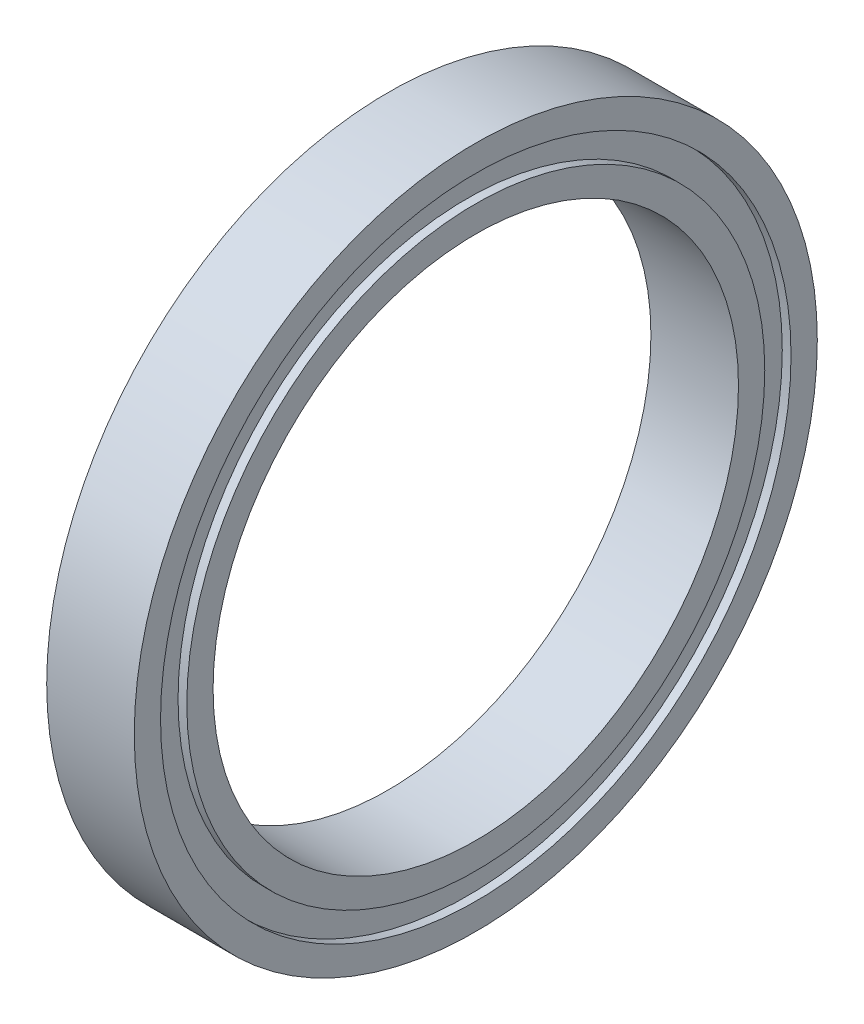
ISO-10303-21;
HEADER;
FILE_DESCRIPTION(('STEP AP214'),'2;1');
FILE_NAME('part.step','',(''),(''),'','','');
FILE_SCHEMA(('AUTOMOTIVE_DESIGN { 1 0 10303 214 1 1 1 1 }'));
ENDSEC;
DATA;
#1=APPLICATION_CONTEXT('core data for automotive mechanical design processes');
#2=APPLICATION_PROTOCOL_DEFINITION('international standard','automotive_design',2000,#1);
#3=PRODUCT_CONTEXT('',#1,'mechanical');
#4=PRODUCT('Part','Part','',(#3));
#5=PRODUCT_RELATED_PRODUCT_CATEGORY('part','',(#4));
#6=PRODUCT_DEFINITION_FORMATION('','',#4);
#7=PRODUCT_DEFINITION_CONTEXT('part definition',#1,'design');
#8=PRODUCT_DEFINITION('design','',#6,#7);
#9=PRODUCT_DEFINITION_SHAPE('','',#8);
#10=(LENGTH_UNIT() NAMED_UNIT(*) SI_UNIT(.MILLI.,.METRE.));
#11=(NAMED_UNIT(*) PLANE_ANGLE_UNIT() SI_UNIT($,.RADIAN.));
#12=(NAMED_UNIT(*) SI_UNIT($,.STERADIAN.) SOLID_ANGLE_UNIT());
#13=UNCERTAINTY_MEASURE_WITH_UNIT(LENGTH_MEASURE(1.E-05),#10,'distance_accuracy_value','');
#14=(GEOMETRIC_REPRESENTATION_CONTEXT(3) GLOBAL_UNCERTAINTY_ASSIGNED_CONTEXT((#13)) GLOBAL_UNIT_ASSIGNED_CONTEXT((#10,
#11,#12)) REPRESENTATION_CONTEXT('',''));
#15=CARTESIAN_POINT('',(0.,0.,0.));
#16=DIRECTION('',(0.,0.,1.));
#17=DIRECTION('',(1.,0.,0.));
#18=AXIS2_PLACEMENT_3D('',#15,#16,#17);
#19=CARTESIAN_POINT('',(0.,0.,0.));
#20=DIRECTION('',(1.,0.,0.));
#21=DIRECTION('',(0.,0.,-1.));
#22=AXIS2_PLACEMENT_3D('',#19,#20,#21);
#23=PLANE('',#22);
#24=CARTESIAN_POINT('',(0.,0.,0.));
#25=DIRECTION('',(1.,0.,0.));
#26=DIRECTION('',(0.,0.,-1.));
#27=AXIS2_PLACEMENT_3D('',#24,#25,#26);
#28=CIRCLE('',#27,30.);
#29=CARTESIAN_POINT('',(0.,0.,-30.));
#30=VERTEX_POINT('',#29);
#31=EDGE_CURVE('E52',#30,#30,#28,.T.);
#32=ORIENTED_EDGE('',*,*,#31,.T.);
#33=EDGE_LOOP('',(#32));
#34=FACE_BOUND('',#33,.T.);
#35=CARTESIAN_POINT('',(0.,0.,0.));
#36=DIRECTION('',(-1.,0.,0.));
#37=DIRECTION('',(0.,0.,1.));
#38=AXIS2_PLACEMENT_3D('',#35,#36,#37);
#39=CIRCLE('',#38,33.);
#40=CARTESIAN_POINT('',(0.,0.,33.));
#41=VERTEX_POINT('',#40);
#42=EDGE_CURVE('E76',#41,#41,#39,.T.);
#43=ORIENTED_EDGE('',*,*,#42,.T.);
#44=EDGE_LOOP('',(#43));
#45=FACE_BOUND('',#44,.T.);
#46=ADVANCED_FACE('F39',(#34,#45),#23,.F.);
#47=CARTESIAN_POINT('',(10.,0.,0.));
#48=DIRECTION('',(1.,0.,0.));
#49=DIRECTION('',(0.,0.,-1.));
#50=AXIS2_PLACEMENT_3D('',#47,#48,#49);
#51=PLANE('',#50);
#52=CARTESIAN_POINT('',(10.,0.,0.));
#53=DIRECTION('',(1.,0.,0.));
#54=DIRECTION('',(0.,0.,-1.));
#55=AXIS2_PLACEMENT_3D('',#52,#53,#54);
#56=CIRCLE('',#55,30.);
#57=CARTESIAN_POINT('',(10.,0.,-30.));
#58=VERTEX_POINT('',#57);
#59=EDGE_CURVE('E50',#58,#58,#56,.T.);
#60=ORIENTED_EDGE('',*,*,#59,.F.);
#61=EDGE_LOOP('',(#60));
#62=FACE_BOUND('',#61,.T.);
#63=CARTESIAN_POINT('',(10.,0.,0.));
#64=DIRECTION('',(1.,0.,0.));
#65=DIRECTION('',(0.,0.,-1.));
#66=AXIS2_PLACEMENT_3D('',#63,#64,#65);
#67=CIRCLE('',#66,33.);
#68=CARTESIAN_POINT('',(10.,0.,-33.));
#69=VERTEX_POINT('',#68);
#70=EDGE_CURVE('E64',#69,#69,#67,.T.);
#71=ORIENTED_EDGE('',*,*,#70,.T.);
#72=EDGE_LOOP('',(#71));
#73=FACE_BOUND('',#72,.T.);
#74=ADVANCED_FACE('F114',(#62,#73),#51,.T.);
#75=CARTESIAN_POINT('',(10.,0.,0.));
#76=DIRECTION('',(1.,0.,0.));
#77=DIRECTION('',(0.,0.,-1.));
#78=AXIS2_PLACEMENT_3D('',#75,#76,#77);
#79=CIRCLE('',#78,36.);
#80=CARTESIAN_POINT('',(10.,0.,-36.));
#81=VERTEX_POINT('',#80);
#82=EDGE_CURVE('E58',#81,#81,#79,.T.);
#83=ORIENTED_EDGE('',*,*,#82,.F.);
#84=EDGE_LOOP('',(#83));
#85=FACE_BOUND('',#84,.T.);
#86=CARTESIAN_POINT('',(10.,0.,0.));
#87=DIRECTION('',(1.,0.,0.));
#88=DIRECTION('',(0.,0.,-1.));
#89=AXIS2_PLACEMENT_3D('',#86,#87,#88);
#90=CIRCLE('',#89,39.);
#91=CARTESIAN_POINT('',(10.,0.,-39.));
#92=VERTEX_POINT('',#91);
#93=EDGE_CURVE('E10',#92,#92,#90,.T.);
#94=ORIENTED_EDGE('',*,*,#93,.T.);
#95=EDGE_LOOP('',(#94));
#96=FACE_BOUND('',#95,.T.);
#97=ADVANCED_FACE('F101',(#85,#96),#51,.T.);
#98=CARTESIAN_POINT('',(0.,0.,0.));
#99=DIRECTION('',(-1.,0.,0.));
#100=DIRECTION('',(0.,0.,1.));
#101=AXIS2_PLACEMENT_3D('',#98,#99,#100);
#102=CIRCLE('',#101,36.);
#103=CARTESIAN_POINT('',(0.,0.,36.));
#104=VERTEX_POINT('',#103);
#105=EDGE_CURVE('E70',#104,#104,#102,.T.);
#106=ORIENTED_EDGE('',*,*,#105,.F.);
#107=EDGE_LOOP('',(#106));
#108=FACE_BOUND('',#107,.T.);
#109=CARTESIAN_POINT('',(0.,0.,0.));
#110=DIRECTION('',(1.,0.,0.));
#111=DIRECTION('',(0.,0.,-1.));
#112=AXIS2_PLACEMENT_3D('',#109,#110,#111);
#113=CIRCLE('',#112,39.);
#114=CARTESIAN_POINT('',(0.,0.,-39.));
#115=VERTEX_POINT('',#114);
#116=EDGE_CURVE('E43',#115,#115,#113,.T.);
#117=ORIENTED_EDGE('',*,*,#116,.F.);
#118=EDGE_LOOP('',(#117));
#119=FACE_BOUND('',#118,.T.);
#120=ADVANCED_FACE('F98',(#108,#119),#23,.F.);
#121=CARTESIAN_POINT('',(10.,0.,0.));
#122=DIRECTION('',(-1.,0.,0.));
#123=DIRECTION('',(0.,0.,1.));
#124=AXIS2_PLACEMENT_3D('',#121,#122,#123);
#125=CYLINDRICAL_SURFACE('',#124,39.);
#126=ORIENTED_EDGE('',*,*,#93,.F.);
#127=EDGE_LOOP('',(#126));
#128=FACE_BOUND('',#127,.T.);
#129=ORIENTED_EDGE('',*,*,#116,.T.);
#130=EDGE_LOOP('',(#129));
#131=FACE_BOUND('',#130,.T.);
#132=ADVANCED_FACE('F41',(#128,#131),#125,.T.);
#133=CARTESIAN_POINT('',(10.,0.,0.));
#134=DIRECTION('',(-1.,0.,0.));
#135=DIRECTION('',(0.,0.,1.));
#136=AXIS2_PLACEMENT_3D('',#133,#134,#135);
#137=CYLINDRICAL_SURFACE('',#136,30.);
#138=ORIENTED_EDGE('',*,*,#59,.T.);
#139=EDGE_LOOP('',(#138));
#140=FACE_BOUND('',#139,.T.);
#141=ORIENTED_EDGE('',*,*,#31,.F.);
#142=EDGE_LOOP('',(#141));
#143=FACE_BOUND('',#142,.T.);
#144=ADVANCED_FACE('F105',(#140,#143),#137,.F.);
#145=CARTESIAN_POINT('',(9.,0.,0.));
#146=DIRECTION('',(1.,0.,0.));
#147=DIRECTION('',(0.,0.,-1.));
#148=AXIS2_PLACEMENT_3D('',#145,#146,#147);
#149=CYLINDRICAL_SURFACE('',#148,36.);
#150=CARTESIAN_POINT('',(9.,0.,0.));
#151=DIRECTION('',(1.,0.,0.));
#152=DIRECTION('',(0.,0.,-1.));
#153=AXIS2_PLACEMENT_3D('',#150,#151,#152);
#154=CIRCLE('',#153,36.);
#155=CARTESIAN_POINT('',(9.,0.,-36.));
#156=VERTEX_POINT('',#155);
#157=EDGE_CURVE('E55',#156,#156,#154,.T.);
#158=ORIENTED_EDGE('',*,*,#157,.F.);
#159=EDGE_LOOP('',(#158));
#160=FACE_BOUND('',#159,.T.);
#161=ORIENTED_EDGE('',*,*,#82,.T.);
#162=EDGE_LOOP('',(#161));
#163=FACE_BOUND('',#162,.T.);
#164=ADVANCED_FACE('F110',(#160,#163),#149,.F.);
#165=CARTESIAN_POINT('',(9.,0.,0.));
#166=DIRECTION('',(1.,0.,0.));
#167=DIRECTION('',(0.,0.,-1.));
#168=AXIS2_PLACEMENT_3D('',#165,#166,#167);
#169=PLANE('',#168);
#170=CARTESIAN_POINT('',(9.,0.,0.));
#171=DIRECTION('',(1.,0.,0.));
#172=DIRECTION('',(0.,0.,-1.));
#173=AXIS2_PLACEMENT_3D('',#170,#171,#172);
#174=CIRCLE('',#173,33.);
#175=CARTESIAN_POINT('',(9.,0.,-33.));
#176=VERTEX_POINT('',#175);
#177=EDGE_CURVE('E61',#176,#176,#174,.T.);
#178=ORIENTED_EDGE('',*,*,#177,.F.);
#179=EDGE_LOOP('',(#178));
#180=FACE_BOUND('',#179,.T.);
#181=ORIENTED_EDGE('',*,*,#157,.T.);
#182=EDGE_LOOP('',(#181));
#183=FACE_BOUND('',#182,.T.);
#184=ADVANCED_FACE('F128',(#180,#183),#169,.T.);
#185=CARTESIAN_POINT('',(9.,0.,0.));
#186=DIRECTION('',(1.,0.,0.));
#187=DIRECTION('',(0.,0.,-1.));
#188=AXIS2_PLACEMENT_3D('',#185,#186,#187);
#189=CYLINDRICAL_SURFACE('',#188,33.);
#190=ORIENTED_EDGE('',*,*,#177,.T.);
#191=EDGE_LOOP('',(#190));
#192=FACE_BOUND('',#191,.T.);
#193=ORIENTED_EDGE('',*,*,#70,.F.);
#194=EDGE_LOOP('',(#193));
#195=FACE_BOUND('',#194,.T.);
#196=ADVANCED_FACE('F94',(#192,#195),#189,.T.);
#197=CARTESIAN_POINT('',(1.,0.,0.));
#198=DIRECTION('',(-1.,0.,0.));
#199=DIRECTION('',(0.,0.,1.));
#200=AXIS2_PLACEMENT_3D('',#197,#198,#199);
#201=CYLINDRICAL_SURFACE('',#200,36.);
#202=CARTESIAN_POINT('',(1.,0.,0.));
#203=DIRECTION('',(-1.,0.,0.));
#204=DIRECTION('',(0.,0.,1.));
#205=AXIS2_PLACEMENT_3D('',#202,#203,#204);
#206=CIRCLE('',#205,36.);
#207=CARTESIAN_POINT('',(1.,0.,36.));
#208=VERTEX_POINT('',#207);
#209=EDGE_CURVE('E67',#208,#208,#206,.T.);
#210=ORIENTED_EDGE('',*,*,#209,.F.);
#211=EDGE_LOOP('',(#210));
#212=FACE_BOUND('',#211,.T.);
#213=ORIENTED_EDGE('',*,*,#105,.T.);
#214=EDGE_LOOP('',(#213));
#215=FACE_BOUND('',#214,.T.);
#216=ADVANCED_FACE('F88',(#212,#215),#201,.F.);
#217=CARTESIAN_POINT('',(1.,0.,0.));
#218=DIRECTION('',(-1.,0.,0.));
#219=DIRECTION('',(0.,0.,1.));
#220=AXIS2_PLACEMENT_3D('',#217,#218,#219);
#221=PLANE('',#220);
#222=CARTESIAN_POINT('',(1.,0.,0.));
#223=DIRECTION('',(-1.,0.,0.));
#224=DIRECTION('',(0.,0.,1.));
#225=AXIS2_PLACEMENT_3D('',#222,#223,#224);
#226=CIRCLE('',#225,33.);
#227=CARTESIAN_POINT('',(1.,0.,33.));
#228=VERTEX_POINT('',#227);
#229=EDGE_CURVE('E73',#228,#228,#226,.T.);
#230=ORIENTED_EDGE('',*,*,#229,.F.);
#231=EDGE_LOOP('',(#230));
#232=FACE_BOUND('',#231,.T.);
#233=ORIENTED_EDGE('',*,*,#209,.T.);
#234=EDGE_LOOP('',(#233));
#235=FACE_BOUND('',#234,.T.);
#236=ADVANCED_FACE('F85',(#232,#235),#221,.T.);
#237=CARTESIAN_POINT('',(1.,0.,0.));
#238=DIRECTION('',(-1.,0.,0.));
#239=DIRECTION('',(0.,0.,1.));
#240=AXIS2_PLACEMENT_3D('',#237,#238,#239);
#241=CYLINDRICAL_SURFACE('',#240,33.);
#242=ORIENTED_EDGE('',*,*,#229,.T.);
#243=EDGE_LOOP('',(#242));
#244=FACE_BOUND('',#243,.T.);
#245=ORIENTED_EDGE('',*,*,#42,.F.);
#246=EDGE_LOOP('',(#245));
#247=FACE_BOUND('',#246,.T.);
#248=ADVANCED_FACE('F82',(#244,#247),#241,.T.);
#249=CLOSED_SHELL('',(#46,#74,#97,#120,#132,#144,#164,#184,#196,#216,#236,#248));
#250=MANIFOLD_SOLID_BREP('B2',#249);
#251=ADVANCED_BREP_SHAPE_REPRESENTATION('',(#18,#250),#14);
#252=SHAPE_DEFINITION_REPRESENTATION(#9,#251);
ENDSEC;
END-ISO-10303-21;
